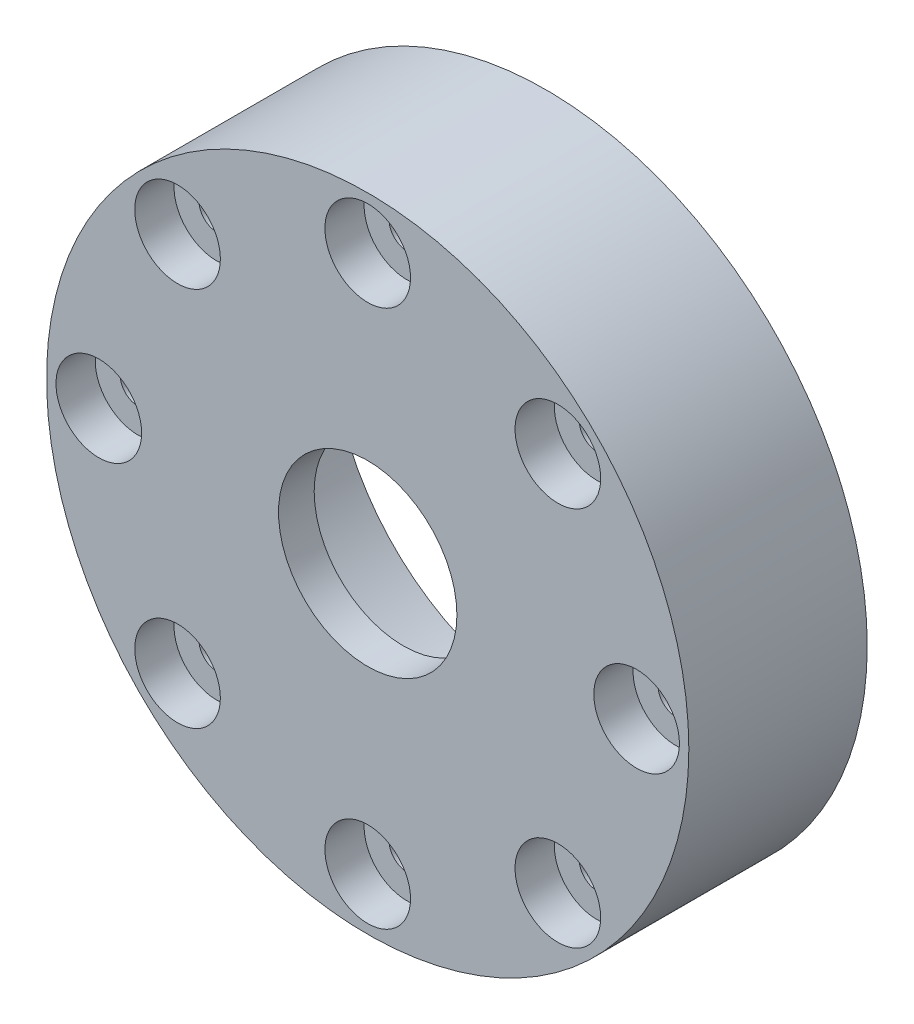
ISO-10303-21;
HEADER;
FILE_DESCRIPTION(('STEP AP214'),'2;1');
FILE_NAME('part.step','',(''),(''),'','','');
FILE_SCHEMA(('AUTOMOTIVE_DESIGN { 1 0 10303 214 1 1 1 1 }'));
ENDSEC;
DATA;
#1=APPLICATION_CONTEXT('core data for automotive mechanical design processes');
#2=APPLICATION_PROTOCOL_DEFINITION('international standard','automotive_design',2000,#1);
#3=PRODUCT_CONTEXT('',#1,'mechanical');
#4=PRODUCT('Part','Part','',(#3));
#5=PRODUCT_RELATED_PRODUCT_CATEGORY('part','',(#4));
#6=PRODUCT_DEFINITION_FORMATION('','',#4);
#7=PRODUCT_DEFINITION_CONTEXT('part definition',#1,'design');
#8=PRODUCT_DEFINITION('design','',#6,#7);
#9=PRODUCT_DEFINITION_SHAPE('','',#8);
#10=(LENGTH_UNIT() NAMED_UNIT(*) SI_UNIT(.MILLI.,.METRE.));
#11=(NAMED_UNIT(*) PLANE_ANGLE_UNIT() SI_UNIT($,.RADIAN.));
#12=(NAMED_UNIT(*) SI_UNIT($,.STERADIAN.) SOLID_ANGLE_UNIT());
#13=UNCERTAINTY_MEASURE_WITH_UNIT(LENGTH_MEASURE(1.E-05),#10,'distance_accuracy_value','');
#14=(GEOMETRIC_REPRESENTATION_CONTEXT(3) GLOBAL_UNCERTAINTY_ASSIGNED_CONTEXT((#13)) GLOBAL_UNIT_ASSIGNED_CONTEXT((#10,
#11,#12)) REPRESENTATION_CONTEXT('',''));
#15=CARTESIAN_POINT('',(0.,0.,0.));
#16=DIRECTION('',(0.,0.,1.));
#17=DIRECTION('',(1.,0.,0.));
#18=AXIS2_PLACEMENT_3D('',#15,#16,#17);
#19=CARTESIAN_POINT('',(-26.6462698338981,26.6462698338981,0.));
#20=DIRECTION('',(0.,0.,1.));
#21=DIRECTION('',(1.,0.,0.));
#22=AXIS2_PLACEMENT_3D('',#19,#20,#21);
#23=CYLINDRICAL_SURFACE('',#22,2.5);
#24=CARTESIAN_POINT('',(-26.6462698338981,26.6462698338981,0.));
#25=DIRECTION('',(0.,0.,1.));
#26=DIRECTION('',(1.,0.,0.));
#27=AXIS2_PLACEMENT_3D('',#24,#25,#26);
#28=CIRCLE('',#27,2.5);
#29=CARTESIAN_POINT('',(-24.1462698338981,26.6462698338981,0.));
#30=VERTEX_POINT('',#29);
#31=EDGE_CURVE('E54',#30,#30,#28,.T.);
#32=ORIENTED_EDGE('',*,*,#31,.F.);
#33=EDGE_LOOP('',(#32));
#34=FACE_BOUND('',#33,.T.);
#35=CARTESIAN_POINT('',(-26.6462698338981,26.6462698338981,19.5));
#36=DIRECTION('',(0.,0.,1.));
#37=DIRECTION('',(1.,0.,0.));
#38=AXIS2_PLACEMENT_3D('',#35,#36,#37);
#39=CIRCLE('',#38,2.5);
#40=CARTESIAN_POINT('',(-24.1462698338981,26.6462698338981,19.5));
#41=VERTEX_POINT('',#40);
#42=EDGE_CURVE('E33',#41,#41,#39,.F.);
#43=ORIENTED_EDGE('',*,*,#42,.F.);
#44=EDGE_LOOP('',(#43));
#45=FACE_BOUND('',#44,.T.);
#46=ADVANCED_FACE('F29',(#34,#45),#23,.F.);
#47=CARTESIAN_POINT('',(-37.6835161857517,0.,0.));
#48=DIRECTION('',(0.,0.,1.));
#49=DIRECTION('',(1.,0.,0.));
#50=AXIS2_PLACEMENT_3D('',#47,#48,#49);
#51=CYLINDRICAL_SURFACE('',#50,2.5);
#52=CARTESIAN_POINT('',(-37.6835161857517,0.,0.));
#53=DIRECTION('',(0.,0.,1.));
#54=DIRECTION('',(1.,0.,0.));
#55=AXIS2_PLACEMENT_3D('',#52,#53,#54);
#56=CIRCLE('',#55,2.5);
#57=CARTESIAN_POINT('',(-35.1835161857517,0.,0.));
#58=VERTEX_POINT('',#57);
#59=EDGE_CURVE('E123',#58,#58,#56,.T.);
#60=ORIENTED_EDGE('',*,*,#59,.F.);
#61=EDGE_LOOP('',(#60));
#62=FACE_BOUND('',#61,.T.);
#63=CARTESIAN_POINT('',(-37.6835161857517,0.,19.5));
#64=DIRECTION('',(0.,0.,1.));
#65=DIRECTION('',(1.,0.,0.));
#66=AXIS2_PLACEMENT_3D('',#63,#64,#65);
#67=CIRCLE('',#66,2.5);
#68=CARTESIAN_POINT('',(-35.1835161857517,0.,19.5));
#69=VERTEX_POINT('',#68);
#70=EDGE_CURVE('E80',#69,#69,#67,.F.);
#71=ORIENTED_EDGE('',*,*,#70,.F.);
#72=EDGE_LOOP('',(#71));
#73=FACE_BOUND('',#72,.T.);
#74=ADVANCED_FACE('F173',(#62,#73),#51,.F.);
#75=CARTESIAN_POINT('',(-26.6462698338981,-26.6462698338981,0.));
#76=DIRECTION('',(0.,0.,1.));
#77=DIRECTION('',(1.,0.,0.));
#78=AXIS2_PLACEMENT_3D('',#75,#76,#77);
#79=CYLINDRICAL_SURFACE('',#78,2.5);
#80=CARTESIAN_POINT('',(-26.6462698338981,-26.6462698338981,0.));
#81=DIRECTION('',(0.,0.,1.));
#82=DIRECTION('',(1.,0.,0.));
#83=AXIS2_PLACEMENT_3D('',#80,#81,#82);
#84=CIRCLE('',#83,2.5);
#85=CARTESIAN_POINT('',(-24.1462698338981,-26.6462698338981,0.));
#86=VERTEX_POINT('',#85);
#87=EDGE_CURVE('E126',#86,#86,#84,.T.);
#88=ORIENTED_EDGE('',*,*,#87,.F.);
#89=EDGE_LOOP('',(#88));
#90=FACE_BOUND('',#89,.T.);
#91=CARTESIAN_POINT('',(-26.6462698338981,-26.6462698338981,19.5));
#92=DIRECTION('',(0.,0.,1.));
#93=DIRECTION('',(1.,0.,0.));
#94=AXIS2_PLACEMENT_3D('',#91,#92,#93);
#95=CIRCLE('',#94,2.5);
#96=CARTESIAN_POINT('',(-24.1462698338981,-26.6462698338981,19.5));
#97=VERTEX_POINT('',#96);
#98=EDGE_CURVE('E76',#97,#97,#95,.F.);
#99=ORIENTED_EDGE('',*,*,#98,.F.);
#100=EDGE_LOOP('',(#99));
#101=FACE_BOUND('',#100,.T.);
#102=ADVANCED_FACE('F180',(#90,#101),#79,.F.);
#103=CARTESIAN_POINT('',(0.,-37.6835161857517,0.));
#104=DIRECTION('',(0.,0.,1.));
#105=DIRECTION('',(1.,0.,0.));
#106=AXIS2_PLACEMENT_3D('',#103,#104,#105);
#107=CYLINDRICAL_SURFACE('',#106,2.5);
#108=CARTESIAN_POINT('',(0.,-37.6835161857517,0.));
#109=DIRECTION('',(0.,0.,1.));
#110=DIRECTION('',(1.,0.,0.));
#111=AXIS2_PLACEMENT_3D('',#108,#109,#110);
#112=CIRCLE('',#111,2.5);
#113=CARTESIAN_POINT('',(2.50000000000001,-37.6835161857517,0.));
#114=VERTEX_POINT('',#113);
#115=EDGE_CURVE('E129',#114,#114,#112,.T.);
#116=ORIENTED_EDGE('',*,*,#115,.F.);
#117=EDGE_LOOP('',(#116));
#118=FACE_BOUND('',#117,.T.);
#119=CARTESIAN_POINT('',(0.,-37.6835161857517,19.5));
#120=DIRECTION('',(0.,0.,1.));
#121=DIRECTION('',(1.,0.,0.));
#122=AXIS2_PLACEMENT_3D('',#119,#120,#121);
#123=CIRCLE('',#122,2.5);
#124=CARTESIAN_POINT('',(2.50000000000001,-37.6835161857517,19.5));
#125=VERTEX_POINT('',#124);
#126=EDGE_CURVE('E71',#125,#125,#123,.F.);
#127=ORIENTED_EDGE('',*,*,#126,.F.);
#128=EDGE_LOOP('',(#127));
#129=FACE_BOUND('',#128,.T.);
#130=ADVANCED_FACE('F191',(#118,#129),#107,.F.);
#131=CARTESIAN_POINT('',(26.6462698338981,-26.6462698338981,0.));
#132=DIRECTION('',(0.,0.,1.));
#133=DIRECTION('',(1.,0.,0.));
#134=AXIS2_PLACEMENT_3D('',#131,#132,#133);
#135=CYLINDRICAL_SURFACE('',#134,2.5);
#136=CARTESIAN_POINT('',(26.6462698338981,-26.6462698338981,0.));
#137=DIRECTION('',(0.,0.,1.));
#138=DIRECTION('',(1.,0.,0.));
#139=AXIS2_PLACEMENT_3D('',#136,#137,#138);
#140=CIRCLE('',#139,2.5);
#141=CARTESIAN_POINT('',(29.1462698338981,-26.6462698338981,0.));
#142=VERTEX_POINT('',#141);
#143=EDGE_CURVE('E132',#142,#142,#140,.T.);
#144=ORIENTED_EDGE('',*,*,#143,.F.);
#145=EDGE_LOOP('',(#144));
#146=FACE_BOUND('',#145,.T.);
#147=CARTESIAN_POINT('',(26.6462698338981,-26.6462698338981,19.5));
#148=DIRECTION('',(0.,0.,1.));
#149=DIRECTION('',(1.,0.,0.));
#150=AXIS2_PLACEMENT_3D('',#147,#148,#149);
#151=CIRCLE('',#150,2.5);
#152=CARTESIAN_POINT('',(29.1462698338981,-26.6462698338981,19.5));
#153=VERTEX_POINT('',#152);
#154=EDGE_CURVE('E66',#153,#153,#151,.F.);
#155=ORIENTED_EDGE('',*,*,#154,.F.);
#156=EDGE_LOOP('',(#155));
#157=FACE_BOUND('',#156,.T.);
#158=ADVANCED_FACE('F195',(#146,#157),#135,.F.);
#159=CARTESIAN_POINT('',(37.6835161857517,0.,0.));
#160=DIRECTION('',(0.,0.,1.));
#161=DIRECTION('',(1.,0.,0.));
#162=AXIS2_PLACEMENT_3D('',#159,#160,#161);
#163=CYLINDRICAL_SURFACE('',#162,2.5);
#164=CARTESIAN_POINT('',(37.6835161857517,0.,0.));
#165=DIRECTION('',(0.,0.,1.));
#166=DIRECTION('',(1.,0.,0.));
#167=AXIS2_PLACEMENT_3D('',#164,#165,#166);
#168=CIRCLE('',#167,2.5);
#169=CARTESIAN_POINT('',(40.1835161857517,0.,0.));
#170=VERTEX_POINT('',#169);
#171=EDGE_CURVE('E135',#170,#170,#168,.T.);
#172=ORIENTED_EDGE('',*,*,#171,.F.);
#173=EDGE_LOOP('',(#172));
#174=FACE_BOUND('',#173,.T.);
#175=CARTESIAN_POINT('',(37.6835161857517,0.,19.5));
#176=DIRECTION('',(0.,0.,1.));
#177=DIRECTION('',(1.,0.,0.));
#178=AXIS2_PLACEMENT_3D('',#175,#176,#177);
#179=CIRCLE('',#178,2.5);
#180=CARTESIAN_POINT('',(40.1835161857517,0.,19.5));
#181=VERTEX_POINT('',#180);
#182=EDGE_CURVE('E61',#181,#181,#179,.F.);
#183=ORIENTED_EDGE('',*,*,#182,.F.);
#184=EDGE_LOOP('',(#183));
#185=FACE_BOUND('',#184,.T.);
#186=ADVANCED_FACE('F199',(#174,#185),#163,.F.);
#187=CARTESIAN_POINT('',(26.6462698338981,26.6462698338981,0.));
#188=DIRECTION('',(0.,0.,1.));
#189=DIRECTION('',(1.,0.,0.));
#190=AXIS2_PLACEMENT_3D('',#187,#188,#189);
#191=CYLINDRICAL_SURFACE('',#190,2.50000000000001);
#192=CARTESIAN_POINT('',(26.6462698338981,26.6462698338981,0.));
#193=DIRECTION('',(0.,0.,1.));
#194=DIRECTION('',(1.,0.,0.));
#195=AXIS2_PLACEMENT_3D('',#192,#193,#194);
#196=CIRCLE('',#195,2.50000000000001);
#197=CARTESIAN_POINT('',(29.1462698338981,26.6462698338981,0.));
#198=VERTEX_POINT('',#197);
#199=EDGE_CURVE('E138',#198,#198,#196,.T.);
#200=ORIENTED_EDGE('',*,*,#199,.F.);
#201=EDGE_LOOP('',(#200));
#202=FACE_BOUND('',#201,.T.);
#203=CARTESIAN_POINT('',(26.6462698338981,26.6462698338981,19.5));
#204=DIRECTION('',(0.,0.,1.));
#205=DIRECTION('',(1.,0.,0.));
#206=AXIS2_PLACEMENT_3D('',#203,#204,#205);
#207=CIRCLE('',#206,2.50000000000001);
#208=CARTESIAN_POINT('',(29.1462698338981,26.6462698338981,19.5));
#209=VERTEX_POINT('',#208);
#210=EDGE_CURVE('E56',#209,#209,#207,.F.);
#211=ORIENTED_EDGE('',*,*,#210,.F.);
#212=EDGE_LOOP('',(#211));
#213=FACE_BOUND('',#212,.T.);
#214=ADVANCED_FACE('F203',(#202,#213),#191,.F.);
#215=CARTESIAN_POINT('',(0.,37.6835161857517,0.));
#216=DIRECTION('',(0.,0.,1.));
#217=DIRECTION('',(1.,0.,0.));
#218=AXIS2_PLACEMENT_3D('',#215,#216,#217);
#219=CYLINDRICAL_SURFACE('',#218,2.5);
#220=CARTESIAN_POINT('',(0.,37.6835161857517,0.));
#221=DIRECTION('',(0.,0.,1.));
#222=DIRECTION('',(1.,0.,0.));
#223=AXIS2_PLACEMENT_3D('',#220,#221,#222);
#224=CIRCLE('',#223,2.5);
#225=CARTESIAN_POINT('',(2.5,37.6835161857517,0.));
#226=VERTEX_POINT('',#225);
#227=EDGE_CURVE('E141',#226,#226,#224,.T.);
#228=ORIENTED_EDGE('',*,*,#227,.F.);
#229=EDGE_LOOP('',(#228));
#230=FACE_BOUND('',#229,.T.);
#231=CARTESIAN_POINT('',(0.,37.6835161857517,19.5));
#232=DIRECTION('',(0.,0.,1.));
#233=DIRECTION('',(1.,0.,0.));
#234=AXIS2_PLACEMENT_3D('',#231,#232,#233);
#235=CIRCLE('',#234,2.5);
#236=CARTESIAN_POINT('',(2.5,37.6835161857517,19.5));
#237=VERTEX_POINT('',#236);
#238=EDGE_CURVE('E51',#237,#237,#235,.F.);
#239=ORIENTED_EDGE('',*,*,#238,.F.);
#240=EDGE_LOOP('',(#239));
#241=FACE_BOUND('',#240,.T.);
#242=ADVANCED_FACE('F169',(#230,#241),#219,.F.);
#243=CARTESIAN_POINT('',(0.,0.,0.));
#244=DIRECTION('',(0.,0.,1.));
#245=DIRECTION('',(1.,0.,0.));
#246=AXIS2_PLACEMENT_3D('',#243,#244,#245);
#247=CYLINDRICAL_SURFACE('',#246,12.5);
#248=CARTESIAN_POINT('',(0.,0.,25.));
#249=DIRECTION('',(0.,0.,1.));
#250=DIRECTION('',(1.,0.,0.));
#251=AXIS2_PLACEMENT_3D('',#248,#249,#250);
#252=CIRCLE('',#251,12.5);
#253=CARTESIAN_POINT('',(12.5,0.,25.));
#254=VERTEX_POINT('',#253);
#255=EDGE_CURVE('E42',#254,#254,#252,.T.);
#256=ORIENTED_EDGE('',*,*,#255,.T.);
#257=EDGE_LOOP('',(#256));
#258=FACE_BOUND('',#257,.T.);
#259=CARTESIAN_POINT('',(0.,0.,20.));
#260=DIRECTION('',(0.,0.,-1.));
#261=DIRECTION('',(-1.,0.,0.));
#262=AXIS2_PLACEMENT_3D('',#259,#260,#261);
#263=CIRCLE('',#262,12.5);
#264=CARTESIAN_POINT('',(-12.5,0.,20.));
#265=VERTEX_POINT('',#264);
#266=EDGE_CURVE('E47',#265,#265,#263,.F.);
#267=ORIENTED_EDGE('',*,*,#266,.F.);
#268=EDGE_LOOP('',(#267));
#269=FACE_BOUND('',#268,.T.);
#270=ADVANCED_FACE('F160',(#258,#269),#247,.F.);
#271=CARTESIAN_POINT('',(0.,0.,25.));
#272=DIRECTION('',(0.,0.,-1.));
#273=DIRECTION('',(-1.,0.,0.));
#274=AXIS2_PLACEMENT_3D('',#271,#272,#273);
#275=CYLINDRICAL_SURFACE('',#274,45.);
#276=CARTESIAN_POINT('',(0.,0.,25.));
#277=DIRECTION('',(0.,0.,1.));
#278=DIRECTION('',(1.,0.,0.));
#279=AXIS2_PLACEMENT_3D('',#276,#277,#278);
#280=CIRCLE('',#279,45.);
#281=CARTESIAN_POINT('',(45.,0.,25.));
#282=VERTEX_POINT('',#281);
#283=EDGE_CURVE('E10',#282,#282,#280,.T.);
#284=ORIENTED_EDGE('',*,*,#283,.F.);
#285=EDGE_LOOP('',(#284));
#286=FACE_BOUND('',#285,.T.);
#287=CARTESIAN_POINT('',(0.,0.,0.));
#288=DIRECTION('',(0.,0.,1.));
#289=DIRECTION('',(1.,0.,0.));
#290=AXIS2_PLACEMENT_3D('',#287,#288,#289);
#291=CIRCLE('',#290,45.);
#292=CARTESIAN_POINT('',(45.,0.,0.));
#293=VERTEX_POINT('',#292);
#294=EDGE_CURVE('E37',#293,#293,#291,.T.);
#295=ORIENTED_EDGE('',*,*,#294,.T.);
#296=EDGE_LOOP('',(#295));
#297=FACE_BOUND('',#296,.T.);
#298=ADVANCED_FACE('F31',(#286,#297),#275,.T.);
#299=CARTESIAN_POINT('',(0.,0.,25.));
#300=DIRECTION('',(0.,0.,1.));
#301=DIRECTION('',(1.,0.,0.));
#302=AXIS2_PLACEMENT_3D('',#299,#300,#301);
#303=PLANE('',#302);
#304=CARTESIAN_POINT('',(-26.6462698338978,26.6462698338984,25.));
#305=DIRECTION('',(0.,0.,1.));
#306=DIRECTION('',(1.,0.,0.));
#307=AXIS2_PLACEMENT_3D('',#304,#305,#306);
#308=CIRCLE('',#307,6.);
#309=CARTESIAN_POINT('',(-20.6462698338978,26.6462698338984,25.));
#310=VERTEX_POINT('',#309);
#311=EDGE_CURVE('E96',#310,#310,#308,.T.);
#312=ORIENTED_EDGE('',*,*,#311,.F.);
#313=EDGE_LOOP('',(#312));
#314=FACE_BOUND('',#313,.T.);
#315=CARTESIAN_POINT('',(-37.6835161857512,-5.42470923538523E-13,25.));
#316=DIRECTION('',(0.,0.,1.));
#317=DIRECTION('',(1.,0.,0.));
#318=AXIS2_PLACEMENT_3D('',#315,#316,#317);
#319=CIRCLE('',#318,6.00000000000105);
#320=CARTESIAN_POINT('',(-31.6835161857502,-5.42470923538523E-13,25.));
#321=VERTEX_POINT('',#320);
#322=EDGE_CURVE('E89',#321,#321,#319,.T.);
#323=ORIENTED_EDGE('',*,*,#322,.F.);
#324=EDGE_LOOP('',(#323));
#325=FACE_BOUND('',#324,.T.);
#326=CARTESIAN_POINT('',(-26.6462698338972,-26.6462698338985,25.));
#327=DIRECTION('',(0.,0.,1.));
#328=DIRECTION('',(1.,0.,0.));
#329=AXIS2_PLACEMENT_3D('',#326,#327,#328);
#330=CIRCLE('',#329,6.00000000000129);
#331=CARTESIAN_POINT('',(-20.6462698338959,-26.6462698338985,25.));
#332=VERTEX_POINT('',#331);
#333=EDGE_CURVE('E82',#332,#332,#330,.T.);
#334=ORIENTED_EDGE('',*,*,#333,.F.);
#335=EDGE_LOOP('',(#334));
#336=FACE_BOUND('',#335,.T.);
#337=CARTESIAN_POINT('',(1.0673776767259E-12,-37.6835161857517,25.));
#338=DIRECTION('',(0.,0.,1.));
#339=DIRECTION('',(1.,0.,0.));
#340=AXIS2_PLACEMENT_3D('',#337,#338,#339);
#341=CIRCLE('',#340,6.00000000000127);
#342=CARTESIAN_POINT('',(6.00000000000234,-37.6835161857517,25.));
#343=VERTEX_POINT('',#342);
#344=EDGE_CURVE('E78',#343,#343,#341,.T.);
#345=ORIENTED_EDGE('',*,*,#344,.F.);
#346=EDGE_LOOP('',(#345));
#347=FACE_BOUND('',#346,.T.);
#348=CARTESIAN_POINT('',(26.646269833899,-26.6462698338977,25.));
#349=DIRECTION('',(0.,0.,1.));
#350=DIRECTION('',(1.,0.,0.));
#351=AXIS2_PLACEMENT_3D('',#348,#349,#350);
#352=CIRCLE('',#351,6.00000000000094);
#353=CARTESIAN_POINT('',(32.6462698338999,-26.6462698338977,25.));
#354=VERTEX_POINT('',#353);
#355=EDGE_CURVE('E74',#354,#354,#352,.T.);
#356=ORIENTED_EDGE('',*,*,#355,.F.);
#357=EDGE_LOOP('',(#356));
#358=FACE_BOUND('',#357,.T.);
#359=CARTESIAN_POINT('',(37.6835161857517,-1.31571369750648E-13,25.));
#360=DIRECTION('',(0.,0.,1.));
#361=DIRECTION('',(1.,0.,0.));
#362=AXIS2_PLACEMENT_3D('',#359,#360,#361);
#363=CIRCLE('',#362,6.);
#364=CARTESIAN_POINT('',(43.6835161857517,-1.31571369750648E-13,25.));
#365=VERTEX_POINT('',#364);
#366=EDGE_CURVE('E69',#365,#365,#363,.T.);
#367=ORIENTED_EDGE('',*,*,#366,.F.);
#368=EDGE_LOOP('',(#367));
#369=FACE_BOUND('',#368,.T.);
#370=CARTESIAN_POINT('',(26.6462698338981,26.646269833898,25.));
#371=DIRECTION('',(0.,0.,1.));
#372=DIRECTION('',(1.,0.,0.));
#373=AXIS2_PLACEMENT_3D('',#370,#371,#372);
#374=CIRCLE('',#373,6.);
#375=CARTESIAN_POINT('',(32.6462698338981,26.646269833898,25.));
#376=VERTEX_POINT('',#375);
#377=EDGE_CURVE('E64',#376,#376,#374,.T.);
#378=ORIENTED_EDGE('',*,*,#377,.F.);
#379=EDGE_LOOP('',(#378));
#380=FACE_BOUND('',#379,.T.);
#381=CARTESIAN_POINT('',(0.,37.6835161857517,25.));
#382=DIRECTION('',(0.,0.,1.));
#383=DIRECTION('',(1.,0.,0.));
#384=AXIS2_PLACEMENT_3D('',#381,#382,#383);
#385=CIRCLE('',#384,6.);
#386=CARTESIAN_POINT('',(6.,37.6835161857517,25.));
#387=VERTEX_POINT('',#386);
#388=EDGE_CURVE('E59',#387,#387,#385,.T.);
#389=ORIENTED_EDGE('',*,*,#388,.F.);
#390=EDGE_LOOP('',(#389));
#391=FACE_BOUND('',#390,.T.);
#392=ORIENTED_EDGE('',*,*,#255,.F.);
#393=EDGE_LOOP('',(#392));
#394=FACE_BOUND('',#393,.T.);
#395=ORIENTED_EDGE('',*,*,#283,.T.);
#396=EDGE_LOOP('',(#395));
#397=FACE_BOUND('',#396,.T.);
#398=ADVANCED_FACE('F155',(#314,#325,#336,#347,#358,#369,#380,#391,#394,#397),#303,.T.);
#399=CARTESIAN_POINT('',(0.,0.,0.));
#400=DIRECTION('',(0.,0.,1.));
#401=DIRECTION('',(1.,0.,0.));
#402=AXIS2_PLACEMENT_3D('',#399,#400,#401);
#403=PLANE('',#402);
#404=ORIENTED_EDGE('',*,*,#31,.T.);
#405=EDGE_LOOP('',(#404));
#406=FACE_BOUND('',#405,.T.);
#407=ORIENTED_EDGE('',*,*,#59,.T.);
#408=EDGE_LOOP('',(#407));
#409=FACE_BOUND('',#408,.T.);
#410=ORIENTED_EDGE('',*,*,#87,.T.);
#411=EDGE_LOOP('',(#410));
#412=FACE_BOUND('',#411,.T.);
#413=ORIENTED_EDGE('',*,*,#115,.T.);
#414=EDGE_LOOP('',(#413));
#415=FACE_BOUND('',#414,.T.);
#416=ORIENTED_EDGE('',*,*,#143,.T.);
#417=EDGE_LOOP('',(#416));
#418=FACE_BOUND('',#417,.T.);
#419=ORIENTED_EDGE('',*,*,#171,.T.);
#420=EDGE_LOOP('',(#419));
#421=FACE_BOUND('',#420,.T.);
#422=ORIENTED_EDGE('',*,*,#199,.T.);
#423=EDGE_LOOP('',(#422));
#424=FACE_BOUND('',#423,.T.);
#425=ORIENTED_EDGE('',*,*,#227,.T.);
#426=EDGE_LOOP('',(#425));
#427=FACE_BOUND('',#426,.T.);
#428=CARTESIAN_POINT('',(0.,0.,0.));
#429=DIRECTION('',(0.,0.,-1.));
#430=DIRECTION('',(-1.,0.,0.));
#431=AXIS2_PLACEMENT_3D('',#428,#429,#430);
#432=CIRCLE('',#431,30.);
#433=CARTESIAN_POINT('',(-30.,0.,0.));
#434=VERTEX_POINT('',#433);
#435=EDGE_CURVE('E144',#434,#434,#432,.T.);
#436=ORIENTED_EDGE('',*,*,#435,.F.);
#437=EDGE_LOOP('',(#436));
#438=FACE_BOUND('',#437,.T.);
#439=ORIENTED_EDGE('',*,*,#294,.F.);
#440=EDGE_LOOP('',(#439));
#441=FACE_BOUND('',#440,.T.);
#442=ADVANCED_FACE('F151',(#406,#409,#412,#415,#418,#421,#424,#427,#438,#441),#403,.F.);
#443=CARTESIAN_POINT('',(0.,0.,20.));
#444=DIRECTION('',(0.,0.,-1.));
#445=DIRECTION('',(-1.,0.,0.));
#446=AXIS2_PLACEMENT_3D('',#443,#444,#445);
#447=PLANE('',#446);
#448=CARTESIAN_POINT('',(0.,0.,20.));
#449=DIRECTION('',(0.,0.,-1.));
#450=DIRECTION('',(-1.,0.,0.));
#451=AXIS2_PLACEMENT_3D('',#448,#449,#450);
#452=CIRCLE('',#451,30.);
#453=CARTESIAN_POINT('',(-30.,0.,20.));
#454=VERTEX_POINT('',#453);
#455=EDGE_CURVE('E50',#454,#454,#452,.T.);
#456=ORIENTED_EDGE('',*,*,#455,.T.);
#457=EDGE_LOOP('',(#456));
#458=FACE_BOUND('',#457,.T.);
#459=ORIENTED_EDGE('',*,*,#266,.T.);
#460=EDGE_LOOP('',(#459));
#461=FACE_BOUND('',#460,.T.);
#462=ADVANCED_FACE('F154',(#458,#461),#447,.T.);
#463=CARTESIAN_POINT('',(0.,0.,20.));
#464=DIRECTION('',(0.,0.,-1.));
#465=DIRECTION('',(-1.,0.,0.));
#466=AXIS2_PLACEMENT_3D('',#463,#464,#465);
#467=CYLINDRICAL_SURFACE('',#466,30.);
#468=ORIENTED_EDGE('',*,*,#455,.F.);
#469=EDGE_LOOP('',(#468));
#470=FACE_BOUND('',#469,.T.);
#471=ORIENTED_EDGE('',*,*,#435,.T.);
#472=EDGE_LOOP('',(#471));
#473=FACE_BOUND('',#472,.T.);
#474=ADVANCED_FACE('F149',(#470,#473),#467,.F.);
#475=CARTESIAN_POINT('',(0.,37.6835161857517,19.5));
#476=DIRECTION('',(0.,0.,1.));
#477=DIRECTION('',(1.,0.,0.));
#478=AXIS2_PLACEMENT_3D('',#475,#476,#477);
#479=PLANE('',#478);
#480=CARTESIAN_POINT('',(0.,37.6835161857517,19.5));
#481=DIRECTION('',(0.,0.,1.));
#482=DIRECTION('',(1.,0.,0.));
#483=AXIS2_PLACEMENT_3D('',#480,#481,#482);
#484=CIRCLE('',#483,6.);
#485=CARTESIAN_POINT('',(6.,37.6835161857517,19.5));
#486=VERTEX_POINT('',#485);
#487=EDGE_CURVE('E55',#486,#486,#484,.T.);
#488=ORIENTED_EDGE('',*,*,#487,.T.);
#489=EDGE_LOOP('',(#488));
#490=FACE_BOUND('',#489,.T.);
#491=ORIENTED_EDGE('',*,*,#238,.T.);
#492=EDGE_LOOP('',(#491));
#493=FACE_BOUND('',#492,.T.);
#494=ADVANCED_FACE('F215',(#490,#493),#479,.T.);
#495=CARTESIAN_POINT('',(0.,37.6835161857517,19.5));
#496=DIRECTION('',(0.,0.,1.));
#497=DIRECTION('',(1.,0.,0.));
#498=AXIS2_PLACEMENT_3D('',#495,#496,#497);
#499=CYLINDRICAL_SURFACE('',#498,6.);
#500=ORIENTED_EDGE('',*,*,#487,.F.);
#501=EDGE_LOOP('',(#500));
#502=FACE_BOUND('',#501,.T.);
#503=ORIENTED_EDGE('',*,*,#388,.T.);
#504=EDGE_LOOP('',(#503));
#505=FACE_BOUND('',#504,.T.);
#506=ADVANCED_FACE('F186',(#502,#505),#499,.F.);
#507=CARTESIAN_POINT('',(26.6462698338981,26.646269833898,19.5));
#508=DIRECTION('',(0.,0.,1.));
#509=DIRECTION('',(1.,0.,0.));
#510=AXIS2_PLACEMENT_3D('',#507,#508,#509);
#511=PLANE('',#510);
#512=CARTESIAN_POINT('',(26.6462698338981,26.646269833898,19.5));
#513=DIRECTION('',(0.,0.,1.));
#514=DIRECTION('',(1.,0.,0.));
#515=AXIS2_PLACEMENT_3D('',#512,#513,#514);
#516=CIRCLE('',#515,6.);
#517=CARTESIAN_POINT('',(32.6462698338981,26.646269833898,19.5));
#518=VERTEX_POINT('',#517);
#519=EDGE_CURVE('E60',#518,#518,#516,.T.);
#520=ORIENTED_EDGE('',*,*,#519,.T.);
#521=EDGE_LOOP('',(#520));
#522=FACE_BOUND('',#521,.T.);
#523=ORIENTED_EDGE('',*,*,#210,.T.);
#524=EDGE_LOOP('',(#523));
#525=FACE_BOUND('',#524,.T.);
#526=ADVANCED_FACE('F228',(#522,#525),#511,.T.);
#527=CARTESIAN_POINT('',(26.6462698338981,26.646269833898,19.5));
#528=DIRECTION('',(0.,0.,1.));
#529=DIRECTION('',(1.,0.,0.));
#530=AXIS2_PLACEMENT_3D('',#527,#528,#529);
#531=CYLINDRICAL_SURFACE('',#530,6.);
#532=ORIENTED_EDGE('',*,*,#519,.F.);
#533=EDGE_LOOP('',(#532));
#534=FACE_BOUND('',#533,.T.);
#535=ORIENTED_EDGE('',*,*,#377,.T.);
#536=EDGE_LOOP('',(#535));
#537=FACE_BOUND('',#536,.T.);
#538=ADVANCED_FACE('F232',(#534,#537),#531,.F.);
#539=CARTESIAN_POINT('',(37.6835161857517,-1.31571369750648E-13,19.5));
#540=DIRECTION('',(0.,0.,1.));
#541=DIRECTION('',(1.,0.,0.));
#542=AXIS2_PLACEMENT_3D('',#539,#540,#541);
#543=PLANE('',#542);
#544=CARTESIAN_POINT('',(37.6835161857517,-1.31571369750648E-13,19.5));
#545=DIRECTION('',(0.,0.,1.));
#546=DIRECTION('',(1.,0.,0.));
#547=AXIS2_PLACEMENT_3D('',#544,#545,#546);
#548=CIRCLE('',#547,6.);
#549=CARTESIAN_POINT('',(43.6835161857517,-1.31571369750648E-13,19.5));
#550=VERTEX_POINT('',#549);
#551=EDGE_CURVE('E65',#550,#550,#548,.T.);
#552=ORIENTED_EDGE('',*,*,#551,.T.);
#553=EDGE_LOOP('',(#552));
#554=FACE_BOUND('',#553,.T.);
#555=ORIENTED_EDGE('',*,*,#182,.T.);
#556=EDGE_LOOP('',(#555));
#557=FACE_BOUND('',#556,.T.);
#558=ADVANCED_FACE('F235',(#554,#557),#543,.T.);
#559=CARTESIAN_POINT('',(37.6835161857517,-1.31571369750648E-13,19.5));
#560=DIRECTION('',(0.,0.,1.));
#561=DIRECTION('',(1.,0.,0.));
#562=AXIS2_PLACEMENT_3D('',#559,#560,#561);
#563=CYLINDRICAL_SURFACE('',#562,6.);
#564=ORIENTED_EDGE('',*,*,#551,.F.);
#565=EDGE_LOOP('',(#564));
#566=FACE_BOUND('',#565,.T.);
#567=ORIENTED_EDGE('',*,*,#366,.T.);
#568=EDGE_LOOP('',(#567));
#569=FACE_BOUND('',#568,.T.);
#570=ADVANCED_FACE('F240',(#566,#569),#563,.F.);
#571=CARTESIAN_POINT('',(26.646269833899,-26.6462698338977,19.5));
#572=DIRECTION('',(0.,0.,1.));
#573=DIRECTION('',(1.,0.,0.));
#574=AXIS2_PLACEMENT_3D('',#571,#572,#573);
#575=PLANE('',#574);
#576=CARTESIAN_POINT('',(26.646269833899,-26.6462698338977,19.5));
#577=DIRECTION('',(0.,0.,1.));
#578=DIRECTION('',(1.,0.,0.));
#579=AXIS2_PLACEMENT_3D('',#576,#577,#578);
#580=CIRCLE('',#579,6.00000000000094);
#581=CARTESIAN_POINT('',(32.6462698338999,-26.6462698338977,19.5));
#582=VERTEX_POINT('',#581);
#583=EDGE_CURVE('E70',#582,#582,#580,.T.);
#584=ORIENTED_EDGE('',*,*,#583,.T.);
#585=EDGE_LOOP('',(#584));
#586=FACE_BOUND('',#585,.T.);
#587=ORIENTED_EDGE('',*,*,#154,.T.);
#588=EDGE_LOOP('',(#587));
#589=FACE_BOUND('',#588,.T.);
#590=ADVANCED_FACE('F243',(#586,#589),#575,.T.);
#591=CARTESIAN_POINT('',(26.646269833899,-26.6462698338977,19.5));
#592=DIRECTION('',(0.,0.,1.));
#593=DIRECTION('',(1.,0.,0.));
#594=AXIS2_PLACEMENT_3D('',#591,#592,#593);
#595=CYLINDRICAL_SURFACE('',#594,6.00000000000094);
#596=ORIENTED_EDGE('',*,*,#583,.F.);
#597=EDGE_LOOP('',(#596));
#598=FACE_BOUND('',#597,.T.);
#599=ORIENTED_EDGE('',*,*,#355,.T.);
#600=EDGE_LOOP('',(#599));
#601=FACE_BOUND('',#600,.T.);
#602=ADVANCED_FACE('F248',(#598,#601),#595,.F.);
#603=CARTESIAN_POINT('',(1.0673776767259E-12,-37.6835161857517,19.5));
#604=DIRECTION('',(0.,0.,1.));
#605=DIRECTION('',(1.,0.,0.));
#606=AXIS2_PLACEMENT_3D('',#603,#604,#605);
#607=PLANE('',#606);
#608=CARTESIAN_POINT('',(1.0673776767259E-12,-37.6835161857517,19.5));
#609=DIRECTION('',(0.,0.,1.));
#610=DIRECTION('',(1.,0.,0.));
#611=AXIS2_PLACEMENT_3D('',#608,#609,#610);
#612=CIRCLE('',#611,6.00000000000127);
#613=CARTESIAN_POINT('',(6.00000000000234,-37.6835161857517,19.5));
#614=VERTEX_POINT('',#613);
#615=EDGE_CURVE('E75',#614,#614,#612,.T.);
#616=ORIENTED_EDGE('',*,*,#615,.T.);
#617=EDGE_LOOP('',(#616));
#618=FACE_BOUND('',#617,.T.);
#619=ORIENTED_EDGE('',*,*,#126,.T.);
#620=EDGE_LOOP('',(#619));
#621=FACE_BOUND('',#620,.T.);
#622=ADVANCED_FACE('F251',(#618,#621),#607,.T.);
#623=CARTESIAN_POINT('',(1.0673776767259E-12,-37.6835161857517,19.5));
#624=DIRECTION('',(0.,0.,1.));
#625=DIRECTION('',(1.,0.,0.));
#626=AXIS2_PLACEMENT_3D('',#623,#624,#625);
#627=CYLINDRICAL_SURFACE('',#626,6.00000000000127);
#628=ORIENTED_EDGE('',*,*,#615,.F.);
#629=EDGE_LOOP('',(#628));
#630=FACE_BOUND('',#629,.T.);
#631=ORIENTED_EDGE('',*,*,#344,.T.);
#632=EDGE_LOOP('',(#631));
#633=FACE_BOUND('',#632,.T.);
#634=ADVANCED_FACE('F256',(#630,#633),#627,.F.);
#635=CARTESIAN_POINT('',(-26.6462698338972,-26.6462698338985,19.5));
#636=DIRECTION('',(0.,0.,1.));
#637=DIRECTION('',(1.,0.,0.));
#638=AXIS2_PLACEMENT_3D('',#635,#636,#637);
#639=PLANE('',#638);
#640=CARTESIAN_POINT('',(-26.6462698338972,-26.6462698338985,19.5));
#641=DIRECTION('',(0.,0.,1.));
#642=DIRECTION('',(1.,0.,0.));
#643=AXIS2_PLACEMENT_3D('',#640,#641,#642);
#644=CIRCLE('',#643,6.00000000000129);
#645=CARTESIAN_POINT('',(-20.6462698338959,-26.6462698338985,19.5));
#646=VERTEX_POINT('',#645);
#647=EDGE_CURVE('E79',#646,#646,#644,.T.);
#648=ORIENTED_EDGE('',*,*,#647,.T.);
#649=EDGE_LOOP('',(#648));
#650=FACE_BOUND('',#649,.T.);
#651=ORIENTED_EDGE('',*,*,#98,.T.);
#652=EDGE_LOOP('',(#651));
#653=FACE_BOUND('',#652,.T.);
#654=ADVANCED_FACE('F259',(#650,#653),#639,.T.);
#655=CARTESIAN_POINT('',(-26.6462698338972,-26.6462698338985,19.5));
#656=DIRECTION('',(0.,0.,1.));
#657=DIRECTION('',(1.,0.,0.));
#658=AXIS2_PLACEMENT_3D('',#655,#656,#657);
#659=CYLINDRICAL_SURFACE('',#658,6.00000000000129);
#660=ORIENTED_EDGE('',*,*,#647,.F.);
#661=EDGE_LOOP('',(#660));
#662=FACE_BOUND('',#661,.T.);
#663=ORIENTED_EDGE('',*,*,#333,.T.);
#664=EDGE_LOOP('',(#663));
#665=FACE_BOUND('',#664,.T.);
#666=ADVANCED_FACE('F264',(#662,#665),#659,.F.);
#667=CARTESIAN_POINT('',(-37.6835161857512,-5.42470923538523E-13,19.5));
#668=DIRECTION('',(0.,0.,1.));
#669=DIRECTION('',(1.,0.,0.));
#670=AXIS2_PLACEMENT_3D('',#667,#668,#669);
#671=PLANE('',#670);
#672=CARTESIAN_POINT('',(-37.6835161857512,-5.42470923538523E-13,19.5));
#673=DIRECTION('',(0.,0.,1.));
#674=DIRECTION('',(1.,0.,0.));
#675=AXIS2_PLACEMENT_3D('',#672,#673,#674);
#676=CIRCLE('',#675,6.00000000000105);
#677=CARTESIAN_POINT('',(-31.6835161857502,-5.42470923538523E-13,19.5));
#678=VERTEX_POINT('',#677);
#679=EDGE_CURVE('E83',#678,#678,#676,.T.);
#680=ORIENTED_EDGE('',*,*,#679,.T.);
#681=EDGE_LOOP('',(#680));
#682=FACE_BOUND('',#681,.T.);
#683=ORIENTED_EDGE('',*,*,#70,.T.);
#684=EDGE_LOOP('',(#683));
#685=FACE_BOUND('',#684,.T.);
#686=ADVANCED_FACE('F267',(#682,#685),#671,.T.);
#687=CARTESIAN_POINT('',(-37.6835161857512,-5.42470923538523E-13,19.5));
#688=DIRECTION('',(0.,0.,1.));
#689=DIRECTION('',(1.,0.,0.));
#690=AXIS2_PLACEMENT_3D('',#687,#688,#689);
#691=CYLINDRICAL_SURFACE('',#690,6.00000000000105);
#692=ORIENTED_EDGE('',*,*,#679,.F.);
#693=EDGE_LOOP('',(#692));
#694=FACE_BOUND('',#693,.T.);
#695=ORIENTED_EDGE('',*,*,#322,.T.);
#696=EDGE_LOOP('',(#695));
#697=FACE_BOUND('',#696,.T.);
#698=ADVANCED_FACE('F272',(#694,#697),#691,.F.);
#699=CARTESIAN_POINT('',(-26.6462698338978,26.6462698338984,19.5));
#700=DIRECTION('',(0.,0.,1.));
#701=DIRECTION('',(1.,0.,0.));
#702=AXIS2_PLACEMENT_3D('',#699,#700,#701);
#703=PLANE('',#702);
#704=CARTESIAN_POINT('',(-26.6462698338978,26.6462698338984,19.5));
#705=DIRECTION('',(0.,0.,1.));
#706=DIRECTION('',(1.,0.,0.));
#707=AXIS2_PLACEMENT_3D('',#704,#705,#706);
#708=CIRCLE('',#707,6.);
#709=CARTESIAN_POINT('',(-20.6462698338978,26.6462698338984,19.5));
#710=VERTEX_POINT('',#709);
#711=EDGE_CURVE('E290',#710,#710,#708,.T.);
#712=ORIENTED_EDGE('',*,*,#711,.T.);
#713=EDGE_LOOP('',(#712));
#714=FACE_BOUND('',#713,.T.);
#715=ORIENTED_EDGE('',*,*,#42,.T.);
#716=EDGE_LOOP('',(#715));
#717=FACE_BOUND('',#716,.T.);
#718=ADVANCED_FACE('F275',(#714,#717),#703,.T.);
#719=CARTESIAN_POINT('',(-26.6462698338978,26.6462698338984,19.5));
#720=DIRECTION('',(0.,0.,1.));
#721=DIRECTION('',(1.,0.,0.));
#722=AXIS2_PLACEMENT_3D('',#719,#720,#721);
#723=CYLINDRICAL_SURFACE('',#722,6.);
#724=ORIENTED_EDGE('',*,*,#711,.F.);
#725=EDGE_LOOP('',(#724));
#726=FACE_BOUND('',#725,.T.);
#727=ORIENTED_EDGE('',*,*,#311,.T.);
#728=EDGE_LOOP('',(#727));
#729=FACE_BOUND('',#728,.T.);
#730=ADVANCED_FACE('F279',(#726,#729),#723,.F.);
#731=CLOSED_SHELL('',(#46,#74,#102,#130,#158,#186,#214,#242,#270,#298,#398,#442,#462,#474,#494,
#506,#526,#538,#558,#570,#590,#602,#622,#634,#654,#666,#686,#698,#718,#730));
#732=MANIFOLD_SOLID_BREP('B2',#731);
#733=ADVANCED_BREP_SHAPE_REPRESENTATION('',(#18,#732),#14);
#734=SHAPE_DEFINITION_REPRESENTATION(#9,#733);
ENDSEC;
END-ISO-10303-21;
